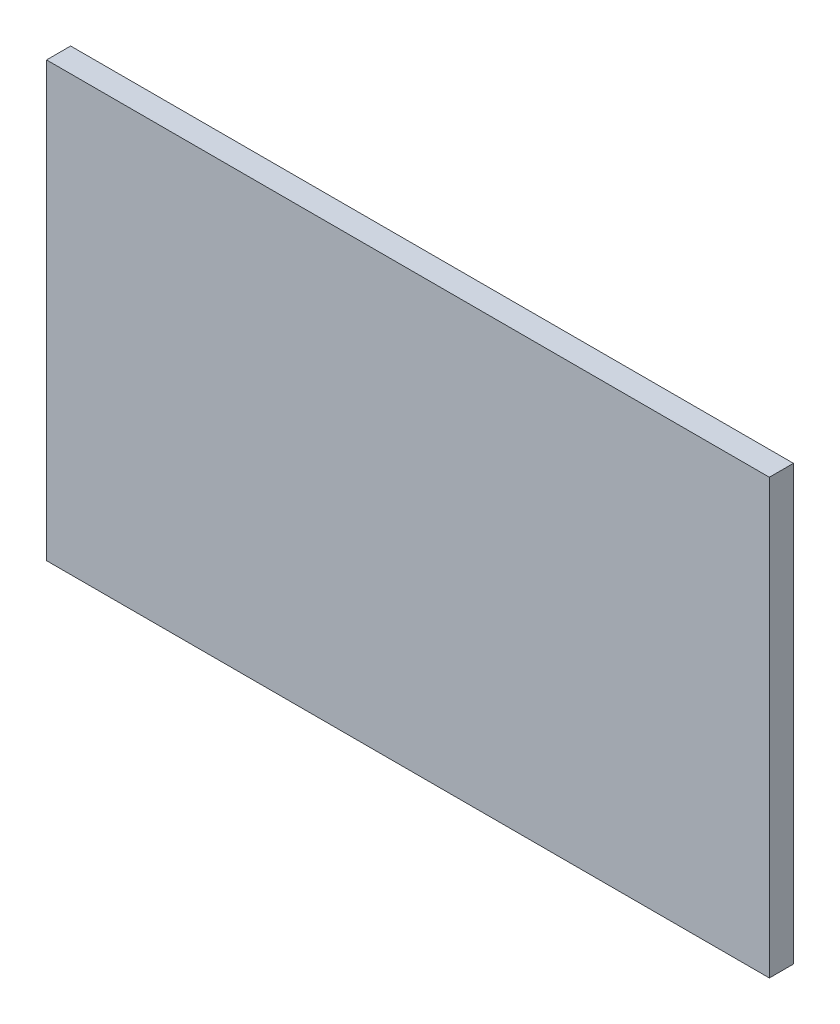
ISO-10303-21;
HEADER;
FILE_DESCRIPTION(('STEP AP214'),'2;1');
FILE_NAME('part.step','',(''),(''),'','','');
FILE_SCHEMA(('AUTOMOTIVE_DESIGN { 1 0 10303 214 1 1 1 1 }'));
ENDSEC;
DATA;
#1=APPLICATION_CONTEXT('core data for automotive mechanical design processes');
#2=APPLICATION_PROTOCOL_DEFINITION('international standard','automotive_design',2000,#1);
#3=PRODUCT_CONTEXT('',#1,'mechanical');
#4=PRODUCT('Part','Part','',(#3));
#5=PRODUCT_RELATED_PRODUCT_CATEGORY('part','',(#4));
#6=PRODUCT_DEFINITION_FORMATION('','',#4);
#7=PRODUCT_DEFINITION_CONTEXT('part definition',#1,'design');
#8=PRODUCT_DEFINITION('design','',#6,#7);
#9=PRODUCT_DEFINITION_SHAPE('','',#8);
#10=(LENGTH_UNIT() NAMED_UNIT(*) SI_UNIT(.MILLI.,.METRE.));
#11=(NAMED_UNIT(*) PLANE_ANGLE_UNIT() SI_UNIT($,.RADIAN.));
#12=(NAMED_UNIT(*) SI_UNIT($,.STERADIAN.) SOLID_ANGLE_UNIT());
#13=UNCERTAINTY_MEASURE_WITH_UNIT(LENGTH_MEASURE(1.E-05),#10,'distance_accuracy_value','');
#14=(GEOMETRIC_REPRESENTATION_CONTEXT(3) GLOBAL_UNCERTAINTY_ASSIGNED_CONTEXT((#13)) GLOBAL_UNIT_ASSIGNED_CONTEXT((#10,
#11,#12)) REPRESENTATION_CONTEXT('',''));
#15=CARTESIAN_POINT('',(0.,0.,0.));
#16=DIRECTION('',(0.,0.,1.));
#17=DIRECTION('',(1.,0.,0.));
#18=AXIS2_PLACEMENT_3D('',#15,#16,#17);
#19=CARTESIAN_POINT('',(0.,0.,10.));
#20=DIRECTION('',(1.,0.,0.));
#21=DIRECTION('',(0.,0.,-1.));
#22=AXIS2_PLACEMENT_3D('',#19,#20,#21);
#23=PLANE('',#22);
#24=DIRECTION('',(0.,-1.,0.));
#25=VECTOR('',#24,1.);
#26=CARTESIAN_POINT('',(0.,0.,0.));
#27=LINE('',#26,#25);
#28=CARTESIAN_POINT('',(0.,180.,0.));
#29=VERTEX_POINT('',#28);
#30=CARTESIAN_POINT('',(0.,0.,0.));
#31=VERTEX_POINT('',#30);
#32=EDGE_CURVE('E113',#29,#31,#27,.T.);
#33=ORIENTED_EDGE('',*,*,#32,.T.);
#34=DIRECTION('',(0.,0.,-1.));
#35=VECTOR('',#34,1.);
#36=CARTESIAN_POINT('',(0.,0.,10.));
#37=LINE('',#36,#35);
#38=CARTESIAN_POINT('',(0.,0.,10.));
#39=VERTEX_POINT('',#38);
#40=EDGE_CURVE('E11',#39,#31,#37,.T.);
#41=ORIENTED_EDGE('',*,*,#40,.F.);
#42=DIRECTION('',(0.,-1.,0.));
#43=VECTOR('',#42,1.);
#44=CARTESIAN_POINT('',(0.,0.,10.));
#45=LINE('',#44,#43);
#46=CARTESIAN_POINT('',(0.,180.,10.));
#47=VERTEX_POINT('',#46);
#48=EDGE_CURVE('E97',#47,#39,#45,.T.);
#49=ORIENTED_EDGE('',*,*,#48,.F.);
#50=DIRECTION('',(0.,0.,-1.));
#51=VECTOR('',#50,1.);
#52=CARTESIAN_POINT('',(0.,180.,10.));
#53=LINE('',#52,#51);
#54=EDGE_CURVE('E109',#47,#29,#53,.T.);
#55=ORIENTED_EDGE('',*,*,#54,.T.);
#56=EDGE_LOOP('',(#33,#41,#49,#55));
#57=FACE_BOUND('',#56,.T.);
#58=ADVANCED_FACE('F45',(#57),#23,.F.);
#59=CARTESIAN_POINT('',(0.,0.,10.));
#60=DIRECTION('',(0.,1.,0.));
#61=DIRECTION('',(0.,0.,1.));
#62=AXIS2_PLACEMENT_3D('',#59,#60,#61);
#63=PLANE('',#62);
#64=DIRECTION('',(1.,0.,0.));
#65=VECTOR('',#64,1.);
#66=CARTESIAN_POINT('',(0.,0.,0.));
#67=LINE('',#66,#65);
#68=CARTESIAN_POINT('',(300.,0.,0.));
#69=VERTEX_POINT('',#68);
#70=EDGE_CURVE('E102',#31,#69,#67,.T.);
#71=ORIENTED_EDGE('',*,*,#70,.T.);
#72=DIRECTION('',(0.,0.,-1.));
#73=VECTOR('',#72,1.);
#74=CARTESIAN_POINT('',(300.,0.,10.));
#75=LINE('',#74,#73);
#76=CARTESIAN_POINT('',(300.,0.,10.));
#77=VERTEX_POINT('',#76);
#78=EDGE_CURVE('E54',#77,#69,#75,.T.);
#79=ORIENTED_EDGE('',*,*,#78,.F.);
#80=DIRECTION('',(1.,0.,0.));
#81=VECTOR('',#80,1.);
#82=CARTESIAN_POINT('',(0.,0.,10.));
#83=LINE('',#82,#81);
#84=EDGE_CURVE('E92',#39,#77,#83,.T.);
#85=ORIENTED_EDGE('',*,*,#84,.F.);
#86=ORIENTED_EDGE('',*,*,#40,.T.);
#87=EDGE_LOOP('',(#71,#79,#85,#86));
#88=FACE_BOUND('',#87,.T.);
#89=ADVANCED_FACE('F101',(#88),#63,.F.);
#90=CARTESIAN_POINT('',(300.,0.,10.));
#91=DIRECTION('',(-1.,0.,0.));
#92=DIRECTION('',(0.,0.,1.));
#93=AXIS2_PLACEMENT_3D('',#90,#91,#92);
#94=PLANE('',#93);
#95=DIRECTION('',(0.,1.,0.));
#96=VECTOR('',#95,1.);
#97=CARTESIAN_POINT('',(300.,0.,0.));
#98=LINE('',#97,#96);
#99=CARTESIAN_POINT('',(300.,180.,0.));
#100=VERTEX_POINT('',#99);
#101=EDGE_CURVE('E79',#69,#100,#98,.T.);
#102=ORIENTED_EDGE('',*,*,#101,.T.);
#103=DIRECTION('',(0.,0.,-1.));
#104=VECTOR('',#103,1.);
#105=CARTESIAN_POINT('',(300.,180.,10.));
#106=LINE('',#105,#104);
#107=CARTESIAN_POINT('',(300.,180.,10.));
#108=VERTEX_POINT('',#107);
#109=EDGE_CURVE('E104',#108,#100,#106,.T.);
#110=ORIENTED_EDGE('',*,*,#109,.F.);
#111=DIRECTION('',(0.,1.,0.));
#112=VECTOR('',#111,1.);
#113=CARTESIAN_POINT('',(300.,0.,10.));
#114=LINE('',#113,#112);
#115=EDGE_CURVE('E95',#77,#108,#114,.T.);
#116=ORIENTED_EDGE('',*,*,#115,.F.);
#117=ORIENTED_EDGE('',*,*,#78,.T.);
#118=EDGE_LOOP('',(#102,#110,#116,#117));
#119=FACE_BOUND('',#118,.T.);
#120=ADVANCED_FACE('F105',(#119),#94,.F.);
#121=CARTESIAN_POINT('',(0.,180.,10.));
#122=DIRECTION('',(0.,-1.,0.));
#123=DIRECTION('',(0.,0.,-1.));
#124=AXIS2_PLACEMENT_3D('',#121,#122,#123);
#125=PLANE('',#124);
#126=DIRECTION('',(-1.,0.,0.));
#127=VECTOR('',#126,1.);
#128=CARTESIAN_POINT('',(0.,180.,0.));
#129=LINE('',#128,#127);
#130=EDGE_CURVE('E85',#100,#29,#129,.T.);
#131=ORIENTED_EDGE('',*,*,#130,.T.);
#132=ORIENTED_EDGE('',*,*,#54,.F.);
#133=DIRECTION('',(-1.,0.,0.));
#134=VECTOR('',#133,1.);
#135=CARTESIAN_POINT('',(0.,180.,10.));
#136=LINE('',#135,#134);
#137=EDGE_CURVE('E62',#108,#47,#136,.T.);
#138=ORIENTED_EDGE('',*,*,#137,.F.);
#139=ORIENTED_EDGE('',*,*,#109,.T.);
#140=EDGE_LOOP('',(#131,#132,#138,#139));
#141=FACE_BOUND('',#140,.T.);
#142=ADVANCED_FACE('F126',(#141),#125,.F.);
#143=CARTESIAN_POINT('',(0.,0.,10.));
#144=DIRECTION('',(0.,0.,-1.));
#145=DIRECTION('',(-1.,0.,0.));
#146=AXIS2_PLACEMENT_3D('',#143,#144,#145);
#147=PLANE('',#146);
#148=ORIENTED_EDGE('',*,*,#48,.T.);
#149=ORIENTED_EDGE('',*,*,#84,.T.);
#150=ORIENTED_EDGE('',*,*,#115,.T.);
#151=ORIENTED_EDGE('',*,*,#137,.T.);
#152=EDGE_LOOP('',(#148,#149,#150,#151));
#153=FACE_BOUND('',#152,.T.);
#154=ADVANCED_FACE('F93',(#153),#147,.F.);
#155=CARTESIAN_POINT('',(0.,0.,0.));
#156=DIRECTION('',(0.,0.,-1.));
#157=DIRECTION('',(-1.,0.,0.));
#158=AXIS2_PLACEMENT_3D('',#155,#156,#157);
#159=PLANE('',#158);
#160=ORIENTED_EDGE('',*,*,#32,.F.);
#161=ORIENTED_EDGE('',*,*,#130,.F.);
#162=ORIENTED_EDGE('',*,*,#101,.F.);
#163=ORIENTED_EDGE('',*,*,#70,.F.);
#164=EDGE_LOOP('',(#160,#161,#162,#163));
#165=FACE_BOUND('',#164,.T.);
#166=ADVANCED_FACE('F129',(#165),#159,.T.);
#167=CLOSED_SHELL('',(#58,#89,#120,#142,#154,#166));
#168=MANIFOLD_SOLID_BREP('B2',#167);
#169=ADVANCED_BREP_SHAPE_REPRESENTATION('',(#18,#168),#14);
#170=SHAPE_DEFINITION_REPRESENTATION(#9,#169);
ENDSEC;
END-ISO-10303-21;
